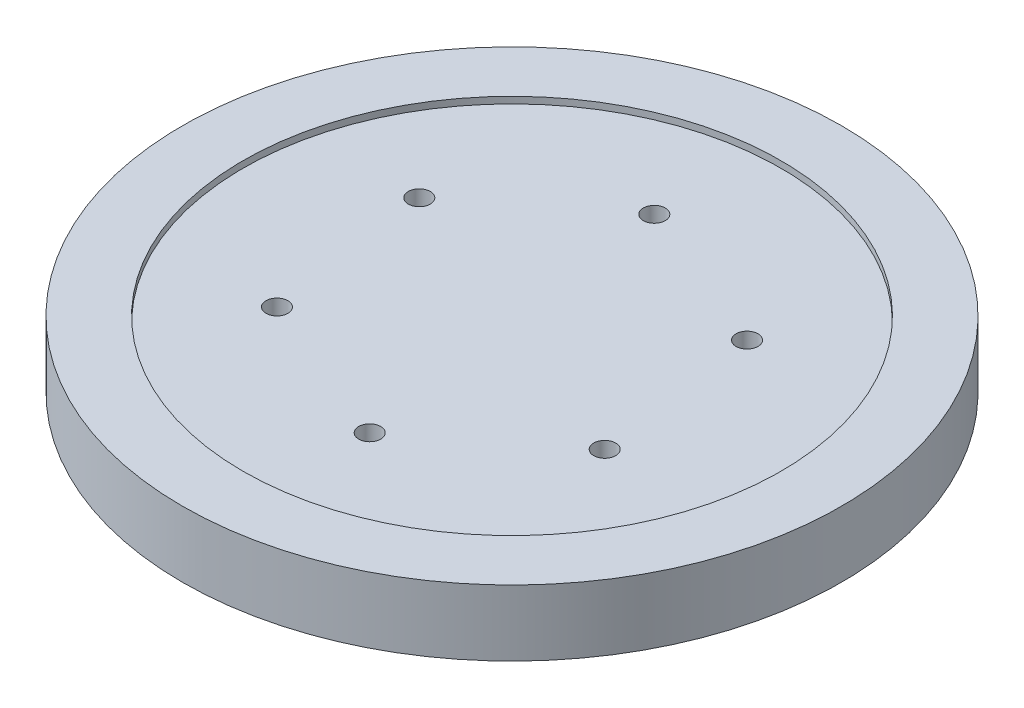
ISO-10303-21;
HEADER;
FILE_DESCRIPTION(('STEP AP214'),'2;1');
FILE_NAME('part.step','',(''),(''),'','','');
FILE_SCHEMA(('AUTOMOTIVE_DESIGN { 1 0 10303 214 1 1 1 1 }'));
ENDSEC;
DATA;
#1=APPLICATION_CONTEXT('core data for automotive mechanical design processes');
#2=APPLICATION_PROTOCOL_DEFINITION('international standard','automotive_design',2000,#1);
#3=PRODUCT_CONTEXT('',#1,'mechanical');
#4=PRODUCT('Part','Part','',(#3));
#5=PRODUCT_RELATED_PRODUCT_CATEGORY('part','',(#4));
#6=PRODUCT_DEFINITION_FORMATION('','',#4);
#7=PRODUCT_DEFINITION_CONTEXT('part definition',#1,'design');
#8=PRODUCT_DEFINITION('design','',#6,#7);
#9=PRODUCT_DEFINITION_SHAPE('','',#8);
#10=(LENGTH_UNIT() NAMED_UNIT(*) SI_UNIT(.MILLI.,.METRE.));
#11=(NAMED_UNIT(*) PLANE_ANGLE_UNIT() SI_UNIT($,.RADIAN.));
#12=(NAMED_UNIT(*) SI_UNIT($,.STERADIAN.) SOLID_ANGLE_UNIT());
#13=UNCERTAINTY_MEASURE_WITH_UNIT(LENGTH_MEASURE(1.E-05),#10,'distance_accuracy_value','');
#14=(GEOMETRIC_REPRESENTATION_CONTEXT(3) GLOBAL_UNCERTAINTY_ASSIGNED_CONTEXT((#13)) GLOBAL_UNIT_ASSIGNED_CONTEXT((#10,
#11,#12)) REPRESENTATION_CONTEXT('',''));
#15=CARTESIAN_POINT('',(0.,0.,0.));
#16=DIRECTION('',(0.,0.,1.));
#17=DIRECTION('',(1.,0.,0.));
#18=AXIS2_PLACEMENT_3D('',#15,#16,#17);
#19=CARTESIAN_POINT('',(0.,15.,0.));
#20=DIRECTION('',(0.,-1.,0.));
#21=DIRECTION('',(0.,0.,-1.));
#22=AXIS2_PLACEMENT_3D('',#19,#20,#21);
#23=CYLINDRICAL_SURFACE('',#22,75.);
#24=CARTESIAN_POINT('',(0.,15.,0.));
#25=DIRECTION('',(0.,1.,0.));
#26=DIRECTION('',(0.,0.,1.));
#27=AXIS2_PLACEMENT_3D('',#24,#25,#26);
#28=CIRCLE('',#27,75.);
#29=CARTESIAN_POINT('',(0.,15.,75.));
#30=VERTEX_POINT('',#29);
#31=EDGE_CURVE('E135',#30,#30,#28,.T.);
#32=ORIENTED_EDGE('',*,*,#31,.F.);
#33=EDGE_LOOP('',(#32));
#34=FACE_BOUND('',#33,.T.);
#35=CARTESIAN_POINT('',(0.,0.,0.));
#36=DIRECTION('',(0.,1.,0.));
#37=DIRECTION('',(0.,0.,1.));
#38=AXIS2_PLACEMENT_3D('',#35,#36,#37);
#39=CIRCLE('',#38,75.);
#40=CARTESIAN_POINT('',(0.,0.,75.));
#41=VERTEX_POINT('',#40);
#42=EDGE_CURVE('E228',#41,#41,#39,.T.);
#43=ORIENTED_EDGE('',*,*,#42,.T.);
#44=EDGE_LOOP('',(#43));
#45=FACE_BOUND('',#44,.T.);
#46=ADVANCED_FACE('F48',(#34,#45),#23,.T.);
#47=CARTESIAN_POINT('',(0.,15.,0.));
#48=DIRECTION('',(0.,1.,0.));
#49=DIRECTION('',(0.,0.,1.));
#50=AXIS2_PLACEMENT_3D('',#47,#48,#49);
#51=PLANE('',#50);
#52=CARTESIAN_POINT('',(0.,15.,0.));
#53=DIRECTION('',(0.,1.,0.));
#54=DIRECTION('',(0.,0.,1.));
#55=AXIS2_PLACEMENT_3D('',#52,#53,#54);
#56=CIRCLE('',#55,61.225);
#57=CARTESIAN_POINT('',(0.,15.,61.225));
#58=VERTEX_POINT('',#57);
#59=EDGE_CURVE('E229',#58,#58,#56,.T.);
#60=ORIENTED_EDGE('',*,*,#59,.F.);
#61=EDGE_LOOP('',(#60));
#62=FACE_BOUND('',#61,.T.);
#63=ORIENTED_EDGE('',*,*,#31,.T.);
#64=EDGE_LOOP('',(#63));
#65=FACE_BOUND('',#64,.T.);
#66=ADVANCED_FACE('F286',(#62,#65),#51,.T.);
#67=CARTESIAN_POINT('',(0.,0.,0.));
#68=DIRECTION('',(0.,1.,0.));
#69=DIRECTION('',(0.,0.,1.));
#70=AXIS2_PLACEMENT_3D('',#67,#68,#69);
#71=PLANE('',#70);
#72=CARTESIAN_POINT('',(35.0406309927205,0.,53.5551519622744));
#73=DIRECTION('',(0.,-1.,0.));
#74=DIRECTION('',(0.,0.,-1.));
#75=AXIS2_PLACEMENT_3D('',#72,#73,#74);
#76=CIRCLE('',#75,2.5);
#77=CARTESIAN_POINT('',(35.0406309927205,0.,51.0551519622744));
#78=VERTEX_POINT('',#77);
#79=EDGE_CURVE('E399',#78,#78,#76,.T.);
#80=ORIENTED_EDGE('',*,*,#79,.F.);
#81=EDGE_LOOP('',(#80));
#82=FACE_BOUND('',#81,.T.);
#83=CARTESIAN_POINT('',(-53.5551519622744,0.,35.0406309927205));
#84=DIRECTION('',(0.,-1.,0.));
#85=DIRECTION('',(0.,0.,-1.));
#86=AXIS2_PLACEMENT_3D('',#83,#84,#85);
#87=CIRCLE('',#86,2.49999999999999);
#88=CARTESIAN_POINT('',(-53.5551519622744,0.,32.5406309927205));
#89=VERTEX_POINT('',#88);
#90=EDGE_CURVE('E403',#89,#89,#87,.T.);
#91=ORIENTED_EDGE('',*,*,#90,.F.);
#92=EDGE_LOOP('',(#91));
#93=FACE_BOUND('',#92,.T.);
#94=CARTESIAN_POINT('',(53.5551519622744,0.,-35.0406309927205));
#95=DIRECTION('',(0.,-1.,0.));
#96=DIRECTION('',(0.,0.,-1.));
#97=AXIS2_PLACEMENT_3D('',#94,#95,#96);
#98=CIRCLE('',#97,2.50000000000001);
#99=CARTESIAN_POINT('',(53.5551519622744,0.,-37.5406309927206));
#100=VERTEX_POINT('',#99);
#101=EDGE_CURVE('E413',#100,#100,#98,.T.);
#102=ORIENTED_EDGE('',*,*,#101,.F.);
#103=EDGE_LOOP('',(#102));
#104=FACE_BOUND('',#103,.T.);
#105=CARTESIAN_POINT('',(-35.0406309927205,0.,-53.5551519622744));
#106=DIRECTION('',(0.,-1.,0.));
#107=DIRECTION('',(0.,0.,-1.));
#108=AXIS2_PLACEMENT_3D('',#105,#106,#107);
#109=CIRCLE('',#108,2.50000000000001);
#110=CARTESIAN_POINT('',(-35.0406309927205,0.,-56.0551519622744));
#111=VERTEX_POINT('',#110);
#112=EDGE_CURVE('E421',#111,#111,#109,.T.);
#113=ORIENTED_EDGE('',*,*,#112,.F.);
#114=EDGE_LOOP('',(#113));
#115=FACE_BOUND('',#114,.T.);
#116=CARTESIAN_POINT('',(-35.3382324383236,0.,-14.241465097911));
#117=DIRECTION('',(0.,1.,0.));
#118=DIRECTION('',(0.,0.,1.));
#119=AXIS2_PLACEMENT_3D('',#116,#117,#118);
#120=CIRCLE('',#119,4.25);
#121=CARTESIAN_POINT('',(-35.3382324383236,0.,-9.991465097911));
#122=VERTEX_POINT('',#121);
#123=EDGE_CURVE('E51',#122,#122,#120,.T.);
#124=ORIENTED_EDGE('',*,*,#123,.T.);
#125=EDGE_LOOP('',(#124));
#126=FACE_BOUND('',#125,.T.);
#127=CARTESIAN_POINT('',(5.33564565726143,0.,37.7245395653829));
#128=DIRECTION('',(0.,1.,0.));
#129=DIRECTION('',(0.,0.,1.));
#130=AXIS2_PLACEMENT_3D('',#127,#128,#129);
#131=CIRCLE('',#130,2.49999999999998);
#132=CARTESIAN_POINT('',(6.63529283236914,0.,39.8601699688551));
#133=VERTEX_POINT('',#132);
#134=CARTESIAN_POINT('',(3.60586236827555,0.,35.9195881053306));
#135=VERTEX_POINT('',#134);
#136=EDGE_CURVE('E148',#133,#135,#131,.T.);
#137=ORIENTED_EDGE('',*,*,#136,.T.);
#138=CARTESIAN_POINT('',(2.38731170579676,0.,39.9911522130136));
#139=DIRECTION('',(0.,1.,0.));
#140=DIRECTION('',(0.,0.,1.));
#141=AXIS2_PLACEMENT_3D('',#138,#139,#140);
#142=CIRCLE('',#141,4.25);
#143=EDGE_CURVE('E445',#135,#133,#142,.T.);
#144=ORIENTED_EDGE('',*,*,#143,.T.);
#145=EDGE_LOOP('',(#137,#144));
#146=FACE_BOUND('',#145,.T.);
#147=CARTESIAN_POINT('',(35.3382324383235,0.,14.241465097911));
#148=DIRECTION('',(0.,1.,0.));
#149=DIRECTION('',(0.,0.,1.));
#150=AXIS2_PLACEMENT_3D('',#147,#148,#149);
#151=CIRCLE('',#150,2.49999999999999);
#152=CARTESIAN_POINT('',(37.2412956025509,0.,15.8626839582013));
#153=VERTEX_POINT('',#152);
#154=CARTESIAN_POINT('',(32.845829239135,0.,14.0467183580796));
#155=VERTEX_POINT('',#154);
#156=EDGE_CURVE('E463',#153,#155,#151,.T.);
#157=ORIENTED_EDGE('',*,*,#156,.T.);
#158=CARTESIAN_POINT('',(33.698527909117,0.,18.2102991460806));
#159=DIRECTION('',(0.,1.,0.));
#160=DIRECTION('',(0.,0.,1.));
#161=AXIS2_PLACEMENT_3D('',#158,#159,#160);
#162=CIRCLE('',#161,4.25);
#163=EDGE_CURVE('E448',#155,#153,#162,.T.);
#164=ORIENTED_EDGE('',*,*,#163,.T.);
#165=EDGE_LOOP('',(#157,#164));
#166=FACE_BOUND('',#165,.T.);
#167=CARTESIAN_POINT('',(30.0025867810619,0.,-23.4830744674723));
#168=DIRECTION('',(0.,1.,0.));
#169=DIRECTION('',(0.,0.,1.));
#170=AXIS2_PLACEMENT_3D('',#167,#168,#169);
#171=CIRCLE('',#170,2.49999999999999);
#172=CARTESIAN_POINT('',(32.501920551117,0.,-23.540786735336));
#173=VERTEX_POINT('',#172);
#174=CARTESIAN_POINT('',(27.5745613195659,0.,-22.8875139261946));
#175=VERTEX_POINT('',#174);
#176=EDGE_CURVE('E219',#173,#175,#171,.T.);
#177=ORIENTED_EDGE('',*,*,#176,.T.);
#178=CARTESIAN_POINT('',(30.491363938717,0.,-19.7964360428482));
#179=DIRECTION('',(0.,1.,0.));
#180=DIRECTION('',(0.,0.,1.));
#181=AXIS2_PLACEMENT_3D('',#178,#179,#180);
#182=CIRCLE('',#181,4.25);
#183=EDGE_CURVE('E452',#175,#173,#182,.T.);
#184=ORIENTED_EDGE('',*,*,#183,.T.);
#185=EDGE_LOOP('',(#177,#184));
#186=FACE_BOUND('',#185,.T.);
#187=CARTESIAN_POINT('',(-5.33564565726188,0.,-37.724539565383));
#188=DIRECTION('',(0.,1.,0.));
#189=DIRECTION('',(0.,0.,1.));
#190=AXIS2_PLACEMENT_3D('',#187,#188,#189);
#191=CIRCLE('',#190,2.5);
#192=CARTESIAN_POINT('',(-4.88814872528278,0.,-40.1841628080503));
#193=VERTEX_POINT('',#192);
#194=CARTESIAN_POINT('',(-7.82764870276106,0.,-37.9243415203855));
#195=VERTEX_POINT('',#194);
#196=EDGE_CURVE('E214',#193,#195,#191,.T.);
#197=ORIENTED_EDGE('',*,*,#196,.T.);
#198=CARTESIAN_POINT('',(-4.02701623500328,0.,-36.022318164844));
#199=DIRECTION('',(0.,1.,0.));
#200=DIRECTION('',(0.,0.,1.));
#201=AXIS2_PLACEMENT_3D('',#198,#199,#200);
#202=CIRCLE('',#201,4.25);
#203=EDGE_CURVE('E196',#195,#193,#202,.T.);
#204=ORIENTED_EDGE('',*,*,#203,.T.);
#205=EDGE_LOOP('',(#197,#204));
#206=FACE_BOUND('',#205,.T.);
#207=CARTESIAN_POINT('',(-30.0025867810622,0.,23.483074467472));
#208=DIRECTION('',(0.,1.,0.));
#209=DIRECTION('',(0.,0.,1.));
#210=AXIS2_PLACEMENT_3D('',#207,#208,#209);
#211=CIRCLE('',#210,2.50000000000001);
#212=CARTESIAN_POINT('',(-28.0962390351631,0.,25.1004298000152));
#213=VERTEX_POINT('',#212);
#214=CARTESIAN_POINT('',(-28.5835516895537,0.,21.4248375012634));
#215=VERTEX_POINT('',#214);
#216=EDGE_CURVE('E207',#213,#215,#211,.T.);
#217=ORIENTED_EDGE('',*,*,#216,.T.);
#218=CARTESIAN_POINT('',(-32.1310684679235,0.,23.7652700910178));
#219=DIRECTION('',(0.,1.,0.));
#220=DIRECTION('',(0.,0.,1.));
#221=AXIS2_PLACEMENT_3D('',#218,#219,#220);
#222=CIRCLE('',#221,4.24999999999997);
#223=EDGE_CURVE('E195',#215,#213,#222,.T.);
#224=ORIENTED_EDGE('',*,*,#223,.T.);
#225=EDGE_LOOP('',(#217,#224));
#226=FACE_BOUND('',#225,.T.);
#227=ORIENTED_EDGE('',*,*,#42,.F.);
#228=EDGE_LOOP('',(#227));
#229=FACE_BOUND('',#228,.T.);
#230=ADVANCED_FACE('F211',(#82,#93,#104,#115,#126,#146,#166,#186,#206,#226,#229),#71,.F.);
#231=CARTESIAN_POINT('',(0.,13.5,0.));
#232=DIRECTION('',(0.,1.,0.));
#233=DIRECTION('',(0.,0.,1.));
#234=AXIS2_PLACEMENT_3D('',#231,#232,#233);
#235=CYLINDRICAL_SURFACE('',#234,61.225);
#236=CARTESIAN_POINT('',(0.,13.5,0.));
#237=DIRECTION('',(0.,1.,0.));
#238=DIRECTION('',(0.,0.,1.));
#239=AXIS2_PLACEMENT_3D('',#236,#237,#238);
#240=CIRCLE('',#239,61.225);
#241=CARTESIAN_POINT('',(0.,13.5,61.225));
#242=VERTEX_POINT('',#241);
#243=EDGE_CURVE('E224',#242,#242,#240,.T.);
#244=ORIENTED_EDGE('',*,*,#243,.F.);
#245=EDGE_LOOP('',(#244));
#246=FACE_BOUND('',#245,.T.);
#247=ORIENTED_EDGE('',*,*,#59,.T.);
#248=EDGE_LOOP('',(#247));
#249=FACE_BOUND('',#248,.T.);
#250=ADVANCED_FACE('F267',(#246,#249),#235,.F.);
#251=CARTESIAN_POINT('',(0.,13.5,0.));
#252=DIRECTION('',(0.,1.,0.));
#253=DIRECTION('',(0.,0.,1.));
#254=AXIS2_PLACEMENT_3D('',#251,#252,#253);
#255=PLANE('',#254);
#256=CARTESIAN_POINT('',(5.33564565726143,13.5,37.7245395653829));
#257=DIRECTION('',(0.,1.,0.));
#258=DIRECTION('',(0.,0.,1.));
#259=AXIS2_PLACEMENT_3D('',#256,#257,#258);
#260=CIRCLE('',#259,2.49999999999998);
#261=CARTESIAN_POINT('',(5.33564565726143,13.5,40.2245395653829));
#262=VERTEX_POINT('',#261);
#263=EDGE_CURVE('E233',#262,#262,#260,.T.);
#264=ORIENTED_EDGE('',*,*,#263,.F.);
#265=EDGE_LOOP('',(#264));
#266=FACE_BOUND('',#265,.T.);
#267=CARTESIAN_POINT('',(35.3382324383235,13.5,14.241465097911));
#268=DIRECTION('',(0.,1.,0.));
#269=DIRECTION('',(0.,0.,1.));
#270=AXIS2_PLACEMENT_3D('',#267,#268,#269);
#271=CIRCLE('',#270,2.49999999999999);
#272=CARTESIAN_POINT('',(35.3382324383235,13.5,16.741465097911));
#273=VERTEX_POINT('',#272);
#274=EDGE_CURVE('E256',#273,#273,#271,.T.);
#275=ORIENTED_EDGE('',*,*,#274,.F.);
#276=EDGE_LOOP('',(#275));
#277=FACE_BOUND('',#276,.T.);
#278=CARTESIAN_POINT('',(30.0025867810619,13.5,-23.4830744674723));
#279=DIRECTION('',(0.,1.,0.));
#280=DIRECTION('',(0.,0.,1.));
#281=AXIS2_PLACEMENT_3D('',#278,#279,#280);
#282=CIRCLE('',#281,2.49999999999999);
#283=CARTESIAN_POINT('',(30.0025867810619,13.5,-20.9830744674723));
#284=VERTEX_POINT('',#283);
#285=EDGE_CURVE('E252',#284,#284,#282,.T.);
#286=ORIENTED_EDGE('',*,*,#285,.F.);
#287=EDGE_LOOP('',(#286));
#288=FACE_BOUND('',#287,.T.);
#289=CARTESIAN_POINT('',(-5.33564565726188,13.5,-37.724539565383));
#290=DIRECTION('',(0.,1.,0.));
#291=DIRECTION('',(0.,0.,1.));
#292=AXIS2_PLACEMENT_3D('',#289,#290,#291);
#293=CIRCLE('',#292,2.5);
#294=CARTESIAN_POINT('',(-5.33564565726188,13.5,-35.224539565383));
#295=VERTEX_POINT('',#294);
#296=EDGE_CURVE('E248',#295,#295,#293,.T.);
#297=ORIENTED_EDGE('',*,*,#296,.F.);
#298=EDGE_LOOP('',(#297));
#299=FACE_BOUND('',#298,.T.);
#300=CARTESIAN_POINT('',(-35.3382324383236,13.5,-14.241465097911));
#301=DIRECTION('',(0.,1.,0.));
#302=DIRECTION('',(0.,0.,1.));
#303=AXIS2_PLACEMENT_3D('',#300,#301,#302);
#304=CIRCLE('',#303,2.5);
#305=CARTESIAN_POINT('',(-35.3382324383236,13.5,-11.741465097911));
#306=VERTEX_POINT('',#305);
#307=EDGE_CURVE('E244',#306,#306,#304,.T.);
#308=ORIENTED_EDGE('',*,*,#307,.F.);
#309=EDGE_LOOP('',(#308));
#310=FACE_BOUND('',#309,.T.);
#311=CARTESIAN_POINT('',(-30.0025867810622,13.5,23.483074467472));
#312=DIRECTION('',(0.,1.,0.));
#313=DIRECTION('',(0.,0.,1.));
#314=AXIS2_PLACEMENT_3D('',#311,#312,#313);
#315=CIRCLE('',#314,2.50000000000001);
#316=CARTESIAN_POINT('',(-30.0025867810622,13.5,25.983074467472));
#317=VERTEX_POINT('',#316);
#318=EDGE_CURVE('E240',#317,#317,#315,.T.);
#319=ORIENTED_EDGE('',*,*,#318,.F.);
#320=EDGE_LOOP('',(#319));
#321=FACE_BOUND('',#320,.T.);
#322=ORIENTED_EDGE('',*,*,#243,.T.);
#323=EDGE_LOOP('',(#322));
#324=FACE_BOUND('',#323,.T.);
#325=ADVANCED_FACE('F264',(#266,#277,#288,#299,#310,#321,#324),#255,.T.);
#326=CARTESIAN_POINT('',(-30.0025867810622,0.,23.483074467472));
#327=DIRECTION('',(0.,1.,0.));
#328=DIRECTION('',(0.,0.,1.));
#329=AXIS2_PLACEMENT_3D('',#326,#327,#328);
#330=CYLINDRICAL_SURFACE('',#329,2.50000000000001);
#331=ORIENTED_EDGE('',*,*,#216,.F.);
#332=DIRECTION('',(0.,1.,0.));
#333=VECTOR('',#332,1.);
#334=CARTESIAN_POINT('',(-28.0962390351631,2.599994,25.1004298000152));
#335=LINE('',#334,#333);
#336=CARTESIAN_POINT('',(-28.0962390351631,5.2,25.1004298000152));
#337=VERTEX_POINT('',#336);
#338=EDGE_CURVE('E12',#213,#337,#335,.T.);
#339=ORIENTED_EDGE('',*,*,#338,.T.);
#340=CARTESIAN_POINT('',(-30.0025867810622,5.2,23.483074467472));
#341=DIRECTION('',(0.,1.,0.));
#342=DIRECTION('',(0.,0.,1.));
#343=AXIS2_PLACEMENT_3D('',#340,#341,#342);
#344=CIRCLE('',#343,2.50000000000001);
#345=CARTESIAN_POINT('',(-28.5835516895537,5.2,21.4248375012634));
#346=VERTEX_POINT('',#345);
#347=EDGE_CURVE('E190',#337,#346,#344,.F.);
#348=ORIENTED_EDGE('',*,*,#347,.T.);
#349=DIRECTION('',(0.,1.,0.));
#350=VECTOR('',#349,1.);
#351=CARTESIAN_POINT('',(-28.5835516895537,2.599994,21.4248375012634));
#352=LINE('',#351,#350);
#353=EDGE_CURVE('E57',#346,#215,#352,.F.);
#354=ORIENTED_EDGE('',*,*,#353,.T.);
#355=EDGE_LOOP('',(#331,#339,#348,#354));
#356=FACE_BOUND('',#355,.T.);
#357=ORIENTED_EDGE('',*,*,#318,.T.);
#358=EDGE_LOOP('',(#357));
#359=FACE_BOUND('',#358,.T.);
#360=ADVANCED_FACE('F205',(#356,#359),#330,.F.);
#361=CARTESIAN_POINT('',(-35.3382324383236,0.,-14.241465097911));
#362=DIRECTION('',(0.,1.,0.));
#363=DIRECTION('',(0.,0.,1.));
#364=AXIS2_PLACEMENT_3D('',#361,#362,#363);
#365=CYLINDRICAL_SURFACE('',#364,2.5);
#366=CARTESIAN_POINT('',(-35.3382324383236,5.2,-14.241465097911));
#367=DIRECTION('',(0.,1.,0.));
#368=DIRECTION('',(0.,0.,1.));
#369=AXIS2_PLACEMENT_3D('',#366,#367,#368);
#370=CIRCLE('',#369,2.5);
#371=CARTESIAN_POINT('',(-35.3382324383236,5.2,-11.741465097911));
#372=VERTEX_POINT('',#371);
#373=EDGE_CURVE('E191',#372,#372,#370,.F.);
#374=ORIENTED_EDGE('',*,*,#373,.T.);
#375=EDGE_LOOP('',(#374));
#376=FACE_BOUND('',#375,.T.);
#377=ORIENTED_EDGE('',*,*,#307,.T.);
#378=EDGE_LOOP('',(#377));
#379=FACE_BOUND('',#378,.T.);
#380=ADVANCED_FACE('F306',(#376,#379),#365,.F.);
#381=CARTESIAN_POINT('',(-5.33564565726188,0.,-37.724539565383));
#382=DIRECTION('',(0.,1.,0.));
#383=DIRECTION('',(0.,0.,1.));
#384=AXIS2_PLACEMENT_3D('',#381,#382,#383);
#385=CYLINDRICAL_SURFACE('',#384,2.5);
#386=ORIENTED_EDGE('',*,*,#196,.F.);
#387=DIRECTION('',(0.,1.,0.));
#388=VECTOR('',#387,1.);
#389=CARTESIAN_POINT('',(-4.88814872528278,2.599994,-40.1841628080503));
#390=LINE('',#389,#388);
#391=CARTESIAN_POINT('',(-4.88814872528278,5.2,-40.1841628080503));
#392=VERTEX_POINT('',#391);
#393=EDGE_CURVE('E186',#193,#392,#390,.T.);
#394=ORIENTED_EDGE('',*,*,#393,.T.);
#395=CARTESIAN_POINT('',(-5.33564565726188,5.2,-37.724539565383));
#396=DIRECTION('',(0.,1.,0.));
#397=DIRECTION('',(0.,0.,1.));
#398=AXIS2_PLACEMENT_3D('',#395,#396,#397);
#399=CIRCLE('',#398,2.5);
#400=CARTESIAN_POINT('',(-7.82764870276106,5.2,-37.9243415203855));
#401=VERTEX_POINT('',#400);
#402=EDGE_CURVE('E178',#392,#401,#399,.F.);
#403=ORIENTED_EDGE('',*,*,#402,.T.);
#404=DIRECTION('',(0.,1.,0.));
#405=VECTOR('',#404,1.);
#406=CARTESIAN_POINT('',(-7.82764870276106,2.599994,-37.9243415203855));
#407=LINE('',#406,#405);
#408=EDGE_CURVE('E182',#401,#195,#407,.F.);
#409=ORIENTED_EDGE('',*,*,#408,.T.);
#410=EDGE_LOOP('',(#386,#394,#403,#409));
#411=FACE_BOUND('',#410,.T.);
#412=ORIENTED_EDGE('',*,*,#296,.T.);
#413=EDGE_LOOP('',(#412));
#414=FACE_BOUND('',#413,.T.);
#415=ADVANCED_FACE('F309',(#411,#414),#385,.F.);
#416=CARTESIAN_POINT('',(30.0025867810619,0.,-23.4830744674723));
#417=DIRECTION('',(0.,1.,0.));
#418=DIRECTION('',(0.,0.,1.));
#419=AXIS2_PLACEMENT_3D('',#416,#417,#418);
#420=CYLINDRICAL_SURFACE('',#419,2.49999999999999);
#421=ORIENTED_EDGE('',*,*,#176,.F.);
#422=DIRECTION('',(0.,1.,0.));
#423=VECTOR('',#422,1.);
#424=CARTESIAN_POINT('',(32.501920551117,2.599994,-23.540786735336));
#425=LINE('',#424,#423);
#426=CARTESIAN_POINT('',(32.501920551117,5.2,-23.540786735336));
#427=VERTEX_POINT('',#426);
#428=EDGE_CURVE('E174',#173,#427,#425,.T.);
#429=ORIENTED_EDGE('',*,*,#428,.T.);
#430=CARTESIAN_POINT('',(30.0025867810619,5.2,-23.4830744674723));
#431=DIRECTION('',(0.,1.,0.));
#432=DIRECTION('',(0.,0.,1.));
#433=AXIS2_PLACEMENT_3D('',#430,#431,#432);
#434=CIRCLE('',#433,2.49999999999999);
#435=CARTESIAN_POINT('',(27.5745613195659,5.2,-22.8875139261946));
#436=VERTEX_POINT('',#435);
#437=EDGE_CURVE('E166',#427,#436,#434,.F.);
#438=ORIENTED_EDGE('',*,*,#437,.T.);
#439=DIRECTION('',(0.,1.,0.));
#440=VECTOR('',#439,1.);
#441=CARTESIAN_POINT('',(27.5745613195659,2.599994,-22.8875139261946));
#442=LINE('',#441,#440);
#443=EDGE_CURVE('E170',#436,#175,#442,.F.);
#444=ORIENTED_EDGE('',*,*,#443,.T.);
#445=EDGE_LOOP('',(#421,#429,#438,#444));
#446=FACE_BOUND('',#445,.T.);
#447=ORIENTED_EDGE('',*,*,#285,.T.);
#448=EDGE_LOOP('',(#447));
#449=FACE_BOUND('',#448,.T.);
#450=ADVANCED_FACE('F313',(#446,#449),#420,.F.);
#451=CARTESIAN_POINT('',(35.3382324383235,0.,14.241465097911));
#452=DIRECTION('',(0.,1.,0.));
#453=DIRECTION('',(0.,0.,1.));
#454=AXIS2_PLACEMENT_3D('',#451,#452,#453);
#455=CYLINDRICAL_SURFACE('',#454,2.49999999999999);
#456=ORIENTED_EDGE('',*,*,#156,.F.);
#457=DIRECTION('',(0.,1.,0.));
#458=VECTOR('',#457,1.);
#459=CARTESIAN_POINT('',(37.2412956025509,2.599994,15.8626839582013));
#460=LINE('',#459,#458);
#461=CARTESIAN_POINT('',(37.2412956025509,5.2,15.8626839582013));
#462=VERTEX_POINT('',#461);
#463=EDGE_CURVE('E162',#153,#462,#460,.T.);
#464=ORIENTED_EDGE('',*,*,#463,.T.);
#465=CARTESIAN_POINT('',(35.3382324383235,5.2,14.241465097911));
#466=DIRECTION('',(0.,1.,0.));
#467=DIRECTION('',(0.,0.,1.));
#468=AXIS2_PLACEMENT_3D('',#465,#466,#467);
#469=CIRCLE('',#468,2.49999999999999);
#470=CARTESIAN_POINT('',(32.845829239135,5.2,14.0467183580796));
#471=VERTEX_POINT('',#470);
#472=EDGE_CURVE('E150',#462,#471,#469,.F.);
#473=ORIENTED_EDGE('',*,*,#472,.T.);
#474=DIRECTION('',(0.,1.,0.));
#475=VECTOR('',#474,1.);
#476=CARTESIAN_POINT('',(32.845829239135,2.599994,14.0467183580796));
#477=LINE('',#476,#475);
#478=EDGE_CURVE('E155',#471,#155,#477,.F.);
#479=ORIENTED_EDGE('',*,*,#478,.T.);
#480=EDGE_LOOP('',(#456,#464,#473,#479));
#481=FACE_BOUND('',#480,.T.);
#482=ORIENTED_EDGE('',*,*,#274,.T.);
#483=EDGE_LOOP('',(#482));
#484=FACE_BOUND('',#483,.T.);
#485=ADVANCED_FACE('F317',(#481,#484),#455,.F.);
#486=CARTESIAN_POINT('',(5.33564565726143,0.,37.7245395653829));
#487=DIRECTION('',(0.,1.,0.));
#488=DIRECTION('',(0.,0.,1.));
#489=AXIS2_PLACEMENT_3D('',#486,#487,#488);
#490=CYLINDRICAL_SURFACE('',#489,2.49999999999998);
#491=ORIENTED_EDGE('',*,*,#136,.F.);
#492=DIRECTION('',(0.,1.,0.));
#493=VECTOR('',#492,1.);
#494=CARTESIAN_POINT('',(6.63529283236914,2.599994,39.8601699688551));
#495=LINE('',#494,#493);
#496=CARTESIAN_POINT('',(6.63529283236914,5.2,39.8601699688551));
#497=VERTEX_POINT('',#496);
#498=EDGE_CURVE('E139',#133,#497,#495,.T.);
#499=ORIENTED_EDGE('',*,*,#498,.T.);
#500=CARTESIAN_POINT('',(5.33564565726143,5.2,37.7245395653829));
#501=DIRECTION('',(0.,1.,0.));
#502=DIRECTION('',(0.,0.,1.));
#503=AXIS2_PLACEMENT_3D('',#500,#501,#502);
#504=CIRCLE('',#503,2.49999999999998);
#505=CARTESIAN_POINT('',(3.60586236827555,5.2,35.9195881053306));
#506=VERTEX_POINT('',#505);
#507=EDGE_CURVE('E125',#497,#506,#504,.F.);
#508=ORIENTED_EDGE('',*,*,#507,.T.);
#509=DIRECTION('',(0.,1.,0.));
#510=VECTOR('',#509,1.);
#511=CARTESIAN_POINT('',(3.60586236827555,2.599994,35.9195881053306));
#512=LINE('',#511,#510);
#513=EDGE_CURVE('E134',#506,#135,#512,.F.);
#514=ORIENTED_EDGE('',*,*,#513,.T.);
#515=EDGE_LOOP('',(#491,#499,#508,#514));
#516=FACE_BOUND('',#515,.T.);
#517=ORIENTED_EDGE('',*,*,#263,.T.);
#518=EDGE_LOOP('',(#517));
#519=FACE_BOUND('',#518,.T.);
#520=ADVANCED_FACE('F145',(#516,#519),#490,.F.);
#521=CARTESIAN_POINT('',(2.38731170579676,-1.2E-05,39.9911522130136));
#522=DIRECTION('',(0.,1.,0.));
#523=DIRECTION('',(0.,0.,1.));
#524=AXIS2_PLACEMENT_3D('',#521,#522,#523);
#525=CYLINDRICAL_SURFACE('',#524,4.25);
#526=ORIENTED_EDGE('',*,*,#143,.F.);
#527=ORIENTED_EDGE('',*,*,#513,.F.);
#528=CARTESIAN_POINT('',(2.38731170579676,5.2,39.9911522130136));
#529=DIRECTION('',(0.,1.,0.));
#530=DIRECTION('',(0.,0.,1.));
#531=AXIS2_PLACEMENT_3D('',#528,#529,#530);
#532=CIRCLE('',#531,4.25);
#533=EDGE_CURVE('E128',#506,#497,#532,.T.);
#534=ORIENTED_EDGE('',*,*,#533,.T.);
#535=ORIENTED_EDGE('',*,*,#498,.F.);
#536=EDGE_LOOP('',(#526,#527,#534,#535));
#537=FACE_BOUND('',#536,.T.);
#538=ADVANCED_FACE('F138',(#537),#525,.F.);
#539=CARTESIAN_POINT('',(2.38731170579676,5.2,39.9911522130136));
#540=DIRECTION('',(0.,1.,0.));
#541=DIRECTION('',(0.,0.,1.));
#542=AXIS2_PLACEMENT_3D('',#539,#540,#541);
#543=PLANE('',#542);
#544=ORIENTED_EDGE('',*,*,#533,.F.);
#545=ORIENTED_EDGE('',*,*,#507,.F.);
#546=EDGE_LOOP('',(#544,#545));
#547=FACE_BOUND('',#546,.T.);
#548=ADVANCED_FACE('F127',(#547),#543,.F.);
#549=CARTESIAN_POINT('',(33.698527909117,-1.2E-05,18.2102991460806));
#550=DIRECTION('',(0.,1.,0.));
#551=DIRECTION('',(0.,0.,1.));
#552=AXIS2_PLACEMENT_3D('',#549,#550,#551);
#553=CYLINDRICAL_SURFACE('',#552,4.25);
#554=ORIENTED_EDGE('',*,*,#163,.F.);
#555=ORIENTED_EDGE('',*,*,#478,.F.);
#556=CARTESIAN_POINT('',(33.698527909117,5.2,18.2102991460806));
#557=DIRECTION('',(0.,1.,0.));
#558=DIRECTION('',(0.,0.,1.));
#559=AXIS2_PLACEMENT_3D('',#556,#557,#558);
#560=CIRCLE('',#559,4.25);
#561=EDGE_CURVE('E433',#471,#462,#560,.T.);
#562=ORIENTED_EDGE('',*,*,#561,.T.);
#563=ORIENTED_EDGE('',*,*,#463,.F.);
#564=EDGE_LOOP('',(#554,#555,#562,#563));
#565=FACE_BOUND('',#564,.T.);
#566=ADVANCED_FACE('F324',(#565),#553,.F.);
#567=CARTESIAN_POINT('',(33.698527909117,5.2,18.2102991460806));
#568=DIRECTION('',(0.,1.,0.));
#569=DIRECTION('',(0.,0.,1.));
#570=AXIS2_PLACEMENT_3D('',#567,#568,#569);
#571=PLANE('',#570);
#572=ORIENTED_EDGE('',*,*,#561,.F.);
#573=ORIENTED_EDGE('',*,*,#472,.F.);
#574=EDGE_LOOP('',(#572,#573));
#575=FACE_BOUND('',#574,.T.);
#576=ADVANCED_FACE('F327',(#575),#571,.F.);
#577=CARTESIAN_POINT('',(30.491363938717,-1.2E-05,-19.7964360428482));
#578=DIRECTION('',(0.,1.,0.));
#579=DIRECTION('',(0.,0.,1.));
#580=AXIS2_PLACEMENT_3D('',#577,#578,#579);
#581=CYLINDRICAL_SURFACE('',#580,4.25);
#582=ORIENTED_EDGE('',*,*,#183,.F.);
#583=ORIENTED_EDGE('',*,*,#443,.F.);
#584=CARTESIAN_POINT('',(30.491363938717,5.2,-19.7964360428482));
#585=DIRECTION('',(0.,1.,0.));
#586=DIRECTION('',(0.,0.,1.));
#587=AXIS2_PLACEMENT_3D('',#584,#585,#586);
#588=CIRCLE('',#587,4.25);
#589=EDGE_CURVE('E429',#436,#427,#588,.T.);
#590=ORIENTED_EDGE('',*,*,#589,.T.);
#591=ORIENTED_EDGE('',*,*,#428,.F.);
#592=EDGE_LOOP('',(#582,#583,#590,#591));
#593=FACE_BOUND('',#592,.T.);
#594=ADVANCED_FACE('F331',(#593),#581,.F.);
#595=CARTESIAN_POINT('',(30.491363938717,5.2,-19.7964360428482));
#596=DIRECTION('',(0.,1.,0.));
#597=DIRECTION('',(0.,0.,1.));
#598=AXIS2_PLACEMENT_3D('',#595,#596,#597);
#599=PLANE('',#598);
#600=ORIENTED_EDGE('',*,*,#589,.F.);
#601=ORIENTED_EDGE('',*,*,#437,.F.);
#602=EDGE_LOOP('',(#600,#601));
#603=FACE_BOUND('',#602,.T.);
#604=ADVANCED_FACE('F357',(#603),#599,.F.);
#605=CARTESIAN_POINT('',(-4.02701623500328,-1.2E-05,-36.022318164844));
#606=DIRECTION('',(0.,1.,0.));
#607=DIRECTION('',(0.,0.,1.));
#608=AXIS2_PLACEMENT_3D('',#605,#606,#607);
#609=CYLINDRICAL_SURFACE('',#608,4.25);
#610=ORIENTED_EDGE('',*,*,#203,.F.);
#611=ORIENTED_EDGE('',*,*,#408,.F.);
#612=CARTESIAN_POINT('',(-4.02701623500328,5.2,-36.022318164844));
#613=DIRECTION('',(0.,1.,0.));
#614=DIRECTION('',(0.,0.,1.));
#615=AXIS2_PLACEMENT_3D('',#612,#613,#614);
#616=CIRCLE('',#615,4.25);
#617=EDGE_CURVE('E70',#401,#392,#616,.T.);
#618=ORIENTED_EDGE('',*,*,#617,.T.);
#619=ORIENTED_EDGE('',*,*,#393,.F.);
#620=EDGE_LOOP('',(#610,#611,#618,#619));
#621=FACE_BOUND('',#620,.T.);
#622=ADVANCED_FACE('F354',(#621),#609,.F.);
#623=CARTESIAN_POINT('',(-4.02701623500328,5.2,-36.022318164844));
#624=DIRECTION('',(0.,1.,0.));
#625=DIRECTION('',(0.,0.,1.));
#626=AXIS2_PLACEMENT_3D('',#623,#624,#625);
#627=PLANE('',#626);
#628=ORIENTED_EDGE('',*,*,#617,.F.);
#629=ORIENTED_EDGE('',*,*,#402,.F.);
#630=EDGE_LOOP('',(#628,#629));
#631=FACE_BOUND('',#630,.T.);
#632=ADVANCED_FACE('F350',(#631),#627,.F.);
#633=CARTESIAN_POINT('',(-35.3382324383236,-1.2E-05,-14.241465097911));
#634=DIRECTION('',(0.,1.,0.));
#635=DIRECTION('',(0.,0.,1.));
#636=AXIS2_PLACEMENT_3D('',#633,#634,#635);
#637=CYLINDRICAL_SURFACE('',#636,4.25);
#638=CARTESIAN_POINT('',(-35.3382324383236,5.2,-14.241465097911));
#639=DIRECTION('',(0.,1.,0.));
#640=DIRECTION('',(0.,0.,1.));
#641=AXIS2_PLACEMENT_3D('',#638,#639,#640);
#642=CIRCLE('',#641,4.25);
#643=CARTESIAN_POINT('',(-35.3382324383236,5.2,-9.991465097911));
#644=VERTEX_POINT('',#643);
#645=EDGE_CURVE('E436',#644,#644,#642,.T.);
#646=CARTESIAN_POINT('',(-35.3382324383236,5.2,-9.991465097911));
#647=CARTESIAN_POINT('',(-35.3382324383236,5.14583333333333,-9.991465097911));
#648=CARTESIAN_POINT('',(-35.3382324383236,5.09166666666667,-9.991465097911));
#649=CARTESIAN_POINT('',(-35.3382324383236,4.98333333333333,-9.991465097911));
#650=CARTESIAN_POINT('',(-35.3382324383236,4.92916666666667,-9.991465097911));
#651=CARTESIAN_POINT('',(-35.3382324383236,4.82083333333333,-9.991465097911));
#652=CARTESIAN_POINT('',(-35.3382324383236,4.76666666666667,-9.991465097911));
#653=CARTESIAN_POINT('',(-35.3382324383236,4.65833333333333,-9.991465097911));
#654=CARTESIAN_POINT('',(-35.3382324383236,4.60416666666667,-9.991465097911));
#655=CARTESIAN_POINT('',(-35.3382324383236,4.49583333333333,-9.991465097911));
#656=CARTESIAN_POINT('',(-35.3382324383236,4.44166666666667,-9.991465097911));
#657=CARTESIAN_POINT('',(-35.3382324383236,4.33333333333333,-9.991465097911));
#658=CARTESIAN_POINT('',(-35.3382324383236,4.27916666666667,-9.991465097911));
#659=CARTESIAN_POINT('',(-35.3382324383236,4.17083333333333,-9.991465097911));
#660=CARTESIAN_POINT('',(-35.3382324383236,4.11666666666667,-9.991465097911));
#661=CARTESIAN_POINT('',(-35.3382324383236,4.00833333333333,-9.991465097911));
#662=CARTESIAN_POINT('',(-35.3382324383236,3.95416666666667,-9.991465097911));
#663=CARTESIAN_POINT('',(-35.3382324383236,3.84583333333333,-9.991465097911));
#664=CARTESIAN_POINT('',(-35.3382324383236,3.79166666666667,-9.991465097911));
#665=CARTESIAN_POINT('',(-35.3382324383236,3.68333333333333,-9.991465097911));
#666=CARTESIAN_POINT('',(-35.3382324383236,3.62916666666667,-9.991465097911));
#667=CARTESIAN_POINT('',(-35.3382324383236,3.52083333333333,-9.991465097911));
#668=CARTESIAN_POINT('',(-35.3382324383236,3.46666666666667,-9.991465097911));
#669=CARTESIAN_POINT('',(-35.3382324383236,3.35833333333333,-9.991465097911));
#670=CARTESIAN_POINT('',(-35.3382324383236,3.30416666666667,-9.991465097911));
#671=CARTESIAN_POINT('',(-35.3382324383236,3.19583333333333,-9.991465097911));
#672=CARTESIAN_POINT('',(-35.3382324383236,3.14166666666667,-9.991465097911));
#673=CARTESIAN_POINT('',(-35.3382324383236,3.03333333333333,-9.991465097911));
#674=CARTESIAN_POINT('',(-35.3382324383236,2.97916666666667,-9.991465097911));
#675=CARTESIAN_POINT('',(-35.3382324383236,2.87083333333333,-9.991465097911));
#676=CARTESIAN_POINT('',(-35.3382324383236,2.81666666666667,-9.991465097911));
#677=CARTESIAN_POINT('',(-35.3382324383236,2.70833333333333,-9.991465097911));
#678=CARTESIAN_POINT('',(-35.3382324383236,2.65416666666667,-9.991465097911));
#679=CARTESIAN_POINT('',(-35.3382324383236,2.54583333333333,-9.991465097911));
#680=CARTESIAN_POINT('',(-35.3382324383236,2.49166666666667,-9.991465097911));
#681=CARTESIAN_POINT('',(-35.3382324383236,2.38333333333333,-9.991465097911));
#682=CARTESIAN_POINT('',(-35.3382324383236,2.32916666666667,-9.991465097911));
#683=CARTESIAN_POINT('',(-35.3382324383236,2.22083333333333,-9.991465097911));
#684=CARTESIAN_POINT('',(-35.3382324383236,2.16666666666667,-9.991465097911));
#685=CARTESIAN_POINT('',(-35.3382324383236,2.05833333333333,-9.991465097911));
#686=CARTESIAN_POINT('',(-35.3382324383236,2.00416666666667,-9.991465097911));
#687=CARTESIAN_POINT('',(-35.3382324383236,1.89583333333333,-9.991465097911));
#688=CARTESIAN_POINT('',(-35.3382324383236,1.84166666666667,-9.991465097911));
#689=CARTESIAN_POINT('',(-35.3382324383236,1.73333333333333,-9.991465097911));
#690=CARTESIAN_POINT('',(-35.3382324383236,1.67916666666667,-9.991465097911));
#691=CARTESIAN_POINT('',(-35.3382324383236,1.57083333333333,-9.991465097911));
#692=CARTESIAN_POINT('',(-35.3382324383236,1.51666666666667,-9.991465097911));
#693=CARTESIAN_POINT('',(-35.3382324383236,1.40833333333333,-9.991465097911));
#694=CARTESIAN_POINT('',(-35.3382324383236,1.35416666666667,-9.991465097911));
#695=CARTESIAN_POINT('',(-35.3382324383236,1.24583333333333,-9.991465097911));
#696=CARTESIAN_POINT('',(-35.3382324383236,1.19166666666667,-9.991465097911));
#697=CARTESIAN_POINT('',(-35.3382324383236,1.08333333333333,-9.991465097911));
#698=CARTESIAN_POINT('',(-35.3382324383236,1.02916666666667,-9.991465097911));
#699=CARTESIAN_POINT('',(-35.3382324383236,0.920833333333333,-9.991465097911));
#700=CARTESIAN_POINT('',(-35.3382324383236,0.866666666666666,-9.991465097911));
#701=CARTESIAN_POINT('',(-35.3382324383236,0.758333333333333,-9.991465097911));
#702=CARTESIAN_POINT('',(-35.3382324383236,0.704166666666666,-9.991465097911));
#703=CARTESIAN_POINT('',(-35.3382324383236,0.595833333333333,-9.991465097911));
#704=CARTESIAN_POINT('',(-35.3382324383236,0.541666666666667,-9.991465097911));
#705=CARTESIAN_POINT('',(-35.3382324383236,0.433333333333333,-9.991465097911));
#706=CARTESIAN_POINT('',(-35.3382324383236,0.379166666666666,-9.991465097911));
#707=CARTESIAN_POINT('',(-35.3382324383236,0.270833333333333,-9.991465097911));
#708=CARTESIAN_POINT('',(-35.3382324383236,0.216666666666667,-9.991465097911));
#709=CARTESIAN_POINT('',(-35.3382324383236,0.108333333333333,-9.991465097911));
#710=CARTESIAN_POINT('',(-35.3382324383236,0.0541666666666665,-9.991465097911));
#711=CARTESIAN_POINT('',(-35.3382324383236,0.,-9.991465097911));
#712=B_SPLINE_CURVE_WITH_KNOTS('',3,(#646,#647,#648,#649,#650,#651,#652,#653,#654,#655,#656,
#657,#658,#659,#660,#661,#662,#663,#664,#665,#666,#667,#668,#669,#670,#671,#672,#673,#674,#675,
#676,#677,#678,#679,#680,#681,#682,#683,#684,#685,#686,#687,#688,#689,#690,#691,#692,#693,#694,
#695,#696,#697,#698,#699,#700,#701,#702,#703,#704,#705,#706,#707,#708,#709,#710,#711),
.UNSPECIFIED.,.F.,.F.,(4,2,2,2,2,2,2,2,2,2,2,2,2,2,2,2,2,2,2,2,2,2,2,2,2,2,2,2,2,2,2,2,4),(0.,
0.1625,0.325,0.4875,0.65,0.8125,0.975,1.1375,1.3,1.4625,1.625,1.7875,1.95,2.1125,2.275,2.4375,
2.6,2.7625,2.925,3.0875,3.25,3.4125,3.575,3.7375,3.9,4.0625,4.225,4.3875,4.55,4.7125,4.875,
5.0375,5.2),.UNSPECIFIED.);
#713=EDGE_CURVE('BSEAM346',#644,#122,#712,.T.);
#714=ORIENTED_EDGE('',*,*,#645,.T.);
#715=ORIENTED_EDGE('',*,*,#123,.F.);
#716=ORIENTED_EDGE('',*,*,#713,.T.);
#717=ORIENTED_EDGE('',*,*,#713,.F.);
#718=EDGE_LOOP('',(#714,#716,#715,#717));
#719=FACE_BOUND('',#718,.T.);
#720=ADVANCED_FACE('F346',(#719),#637,.F.);
#721=CARTESIAN_POINT('',(-35.3382324383236,5.2,-14.241465097911));
#722=DIRECTION('',(0.,1.,0.));
#723=DIRECTION('',(0.,0.,1.));
#724=AXIS2_PLACEMENT_3D('',#721,#722,#723);
#725=PLANE('',#724);
#726=ORIENTED_EDGE('',*,*,#645,.F.);
#727=EDGE_LOOP('',(#726));
#728=FACE_BOUND('',#727,.T.);
#729=ORIENTED_EDGE('',*,*,#373,.F.);
#730=EDGE_LOOP('',(#729));
#731=FACE_BOUND('',#730,.T.);
#732=ADVANCED_FACE('F343',(#728,#731),#725,.F.);
#733=CARTESIAN_POINT('',(-32.1310684679235,-1.2E-05,23.7652700910178));
#734=DIRECTION('',(0.,1.,0.));
#735=DIRECTION('',(0.,0.,1.));
#736=AXIS2_PLACEMENT_3D('',#733,#734,#735);
#737=CYLINDRICAL_SURFACE('',#736,4.24999999999997);
#738=ORIENTED_EDGE('',*,*,#223,.F.);
#739=ORIENTED_EDGE('',*,*,#353,.F.);
#740=CARTESIAN_POINT('',(-32.1310684679235,5.2,23.7652700910178));
#741=DIRECTION('',(0.,1.,0.));
#742=DIRECTION('',(0.,0.,1.));
#743=AXIS2_PLACEMENT_3D('',#740,#741,#742);
#744=CIRCLE('',#743,4.24999999999997);
#745=EDGE_CURVE('E63',#346,#337,#744,.T.);
#746=ORIENTED_EDGE('',*,*,#745,.T.);
#747=ORIENTED_EDGE('',*,*,#338,.F.);
#748=EDGE_LOOP('',(#738,#739,#746,#747));
#749=FACE_BOUND('',#748,.T.);
#750=ADVANCED_FACE('F340',(#749),#737,.F.);
#751=CARTESIAN_POINT('',(-32.1310684679235,5.2,23.7652700910178));
#752=DIRECTION('',(0.,1.,0.));
#753=DIRECTION('',(0.,0.,1.));
#754=AXIS2_PLACEMENT_3D('',#751,#752,#753);
#755=PLANE('',#754);
#756=ORIENTED_EDGE('',*,*,#745,.F.);
#757=ORIENTED_EDGE('',*,*,#347,.F.);
#758=EDGE_LOOP('',(#756,#757));
#759=FACE_BOUND('',#758,.T.);
#760=ADVANCED_FACE('F337',(#759),#755,.F.);
#761=CARTESIAN_POINT('',(-35.0406309927205,10.,-53.5551519622744));
#762=DIRECTION('',(0.,-1.,0.));
#763=DIRECTION('',(0.,0.,-1.));
#764=AXIS2_PLACEMENT_3D('',#761,#762,#763);
#765=CYLINDRICAL_SURFACE('',#764,2.50000000000001);
#766=CARTESIAN_POINT('',(-35.0406309927205,10.,-53.5551519622744));
#767=DIRECTION('',(0.,-1.,0.));
#768=DIRECTION('',(0.,0.,-1.));
#769=AXIS2_PLACEMENT_3D('',#766,#767,#768);
#770=CIRCLE('',#769,2.50000000000001);
#771=CARTESIAN_POINT('',(-35.0406309927205,10.,-56.0551519622744));
#772=VERTEX_POINT('',#771);
#773=EDGE_CURVE('E425',#772,#772,#770,.T.);
#774=ORIENTED_EDGE('',*,*,#773,.F.);
#775=EDGE_LOOP('',(#774));
#776=FACE_BOUND('',#775,.T.);
#777=ORIENTED_EDGE('',*,*,#112,.T.);
#778=EDGE_LOOP('',(#777));
#779=FACE_BOUND('',#778,.T.);
#780=ADVANCED_FACE('F339',(#776,#779),#765,.F.);
#781=CARTESIAN_POINT('',(-35.0406309927205,10.,-53.5551519622744));
#782=DIRECTION('',(0.,-1.,0.));
#783=DIRECTION('',(0.,0.,-1.));
#784=AXIS2_PLACEMENT_3D('',#781,#782,#783);
#785=PLANE('',#784);
#786=ORIENTED_EDGE('',*,*,#773,.T.);
#787=EDGE_LOOP('',(#786));
#788=FACE_BOUND('',#787,.T.);
#789=ADVANCED_FACE('F365',(#788),#785,.T.);
#790=CARTESIAN_POINT('',(53.5551519622744,10.,-35.0406309927205));
#791=DIRECTION('',(0.,-1.,0.));
#792=DIRECTION('',(0.,0.,-1.));
#793=AXIS2_PLACEMENT_3D('',#790,#791,#792);
#794=CYLINDRICAL_SURFACE('',#793,2.50000000000001);
#795=CARTESIAN_POINT('',(53.5551519622744,10.,-35.0406309927205));
#796=DIRECTION('',(0.,-1.,0.));
#797=DIRECTION('',(0.,0.,-1.));
#798=AXIS2_PLACEMENT_3D('',#795,#796,#797);
#799=CIRCLE('',#798,2.50000000000001);
#800=CARTESIAN_POINT('',(53.5551519622744,10.,-37.5406309927206));
#801=VERTEX_POINT('',#800);
#802=EDGE_CURVE('E417',#801,#801,#799,.T.);
#803=ORIENTED_EDGE('',*,*,#802,.F.);
#804=EDGE_LOOP('',(#803));
#805=FACE_BOUND('',#804,.T.);
#806=ORIENTED_EDGE('',*,*,#101,.T.);
#807=EDGE_LOOP('',(#806));
#808=FACE_BOUND('',#807,.T.);
#809=ADVANCED_FACE('F368',(#805,#808),#794,.F.);
#810=CARTESIAN_POINT('',(53.5551519622744,10.,-35.0406309927205));
#811=DIRECTION('',(0.,-1.,0.));
#812=DIRECTION('',(0.,0.,-1.));
#813=AXIS2_PLACEMENT_3D('',#810,#811,#812);
#814=PLANE('',#813);
#815=ORIENTED_EDGE('',*,*,#802,.T.);
#816=EDGE_LOOP('',(#815));
#817=FACE_BOUND('',#816,.T.);
#818=ADVANCED_FACE('F372',(#817),#814,.T.);
#819=CARTESIAN_POINT('',(-53.5551519622744,10.,35.0406309927205));
#820=DIRECTION('',(0.,-1.,0.));
#821=DIRECTION('',(0.,0.,-1.));
#822=AXIS2_PLACEMENT_3D('',#819,#820,#821);
#823=CYLINDRICAL_SURFACE('',#822,2.49999999999999);
#824=CARTESIAN_POINT('',(-53.5551519622744,10.,35.0406309927205));
#825=DIRECTION('',(0.,-1.,0.));
#826=DIRECTION('',(0.,0.,-1.));
#827=AXIS2_PLACEMENT_3D('',#824,#825,#826);
#828=CIRCLE('',#827,2.49999999999999);
#829=CARTESIAN_POINT('',(-53.5551519622744,10.,32.5406309927205));
#830=VERTEX_POINT('',#829);
#831=EDGE_CURVE('E409',#830,#830,#828,.T.);
#832=ORIENTED_EDGE('',*,*,#831,.F.);
#833=EDGE_LOOP('',(#832));
#834=FACE_BOUND('',#833,.T.);
#835=ORIENTED_EDGE('',*,*,#90,.T.);
#836=EDGE_LOOP('',(#835));
#837=FACE_BOUND('',#836,.T.);
#838=ADVANCED_FACE('F375',(#834,#837),#823,.F.);
#839=CARTESIAN_POINT('',(-53.5551519622744,10.,35.0406309927205));
#840=DIRECTION('',(0.,-1.,0.));
#841=DIRECTION('',(0.,0.,-1.));
#842=AXIS2_PLACEMENT_3D('',#839,#840,#841);
#843=PLANE('',#842);
#844=ORIENTED_EDGE('',*,*,#831,.T.);
#845=EDGE_LOOP('',(#844));
#846=FACE_BOUND('',#845,.T.);
#847=ADVANCED_FACE('F380',(#846),#843,.T.);
#848=CARTESIAN_POINT('',(35.0406309927205,10.,53.5551519622744));
#849=DIRECTION('',(0.,-1.,0.));
#850=DIRECTION('',(0.,0.,-1.));
#851=AXIS2_PLACEMENT_3D('',#848,#849,#850);
#852=CYLINDRICAL_SURFACE('',#851,2.5);
#853=CARTESIAN_POINT('',(35.0406309927205,10.,53.5551519622744));
#854=DIRECTION('',(0.,-1.,0.));
#855=DIRECTION('',(0.,0.,-1.));
#856=AXIS2_PLACEMENT_3D('',#853,#854,#855);
#857=CIRCLE('',#856,2.5);
#858=CARTESIAN_POINT('',(35.0406309927205,10.,51.0551519622744));
#859=VERTEX_POINT('',#858);
#860=EDGE_CURVE('E142',#859,#859,#857,.T.);
#861=ORIENTED_EDGE('',*,*,#860,.F.);
#862=EDGE_LOOP('',(#861));
#863=FACE_BOUND('',#862,.T.);
#864=ORIENTED_EDGE('',*,*,#79,.T.);
#865=EDGE_LOOP('',(#864));
#866=FACE_BOUND('',#865,.T.);
#867=ADVANCED_FACE('F383',(#863,#866),#852,.F.);
#868=CARTESIAN_POINT('',(35.0406309927205,10.,53.5551519622744));
#869=DIRECTION('',(0.,-1.,0.));
#870=DIRECTION('',(0.,0.,-1.));
#871=AXIS2_PLACEMENT_3D('',#868,#869,#870);
#872=PLANE('',#871);
#873=ORIENTED_EDGE('',*,*,#860,.T.);
#874=EDGE_LOOP('',(#873));
#875=FACE_BOUND('',#874,.T.);
#876=ADVANCED_FACE('F390',(#875),#872,.T.);
#877=CLOSED_SHELL('',(#46,#66,#230,#250,#325,#360,#380,#415,#450,#485,#520,#538,#548,#566,#576,
#594,#604,#622,#632,#720,#732,#750,#760,#780,#789,#809,#818,#838,#847,#867,#876));
#878=MANIFOLD_SOLID_BREP('B2',#877);
#879=ADVANCED_BREP_SHAPE_REPRESENTATION('',(#18,#878),#14);
#880=SHAPE_DEFINITION_REPRESENTATION(#9,#879);
ENDSEC;
END-ISO-10303-21;
